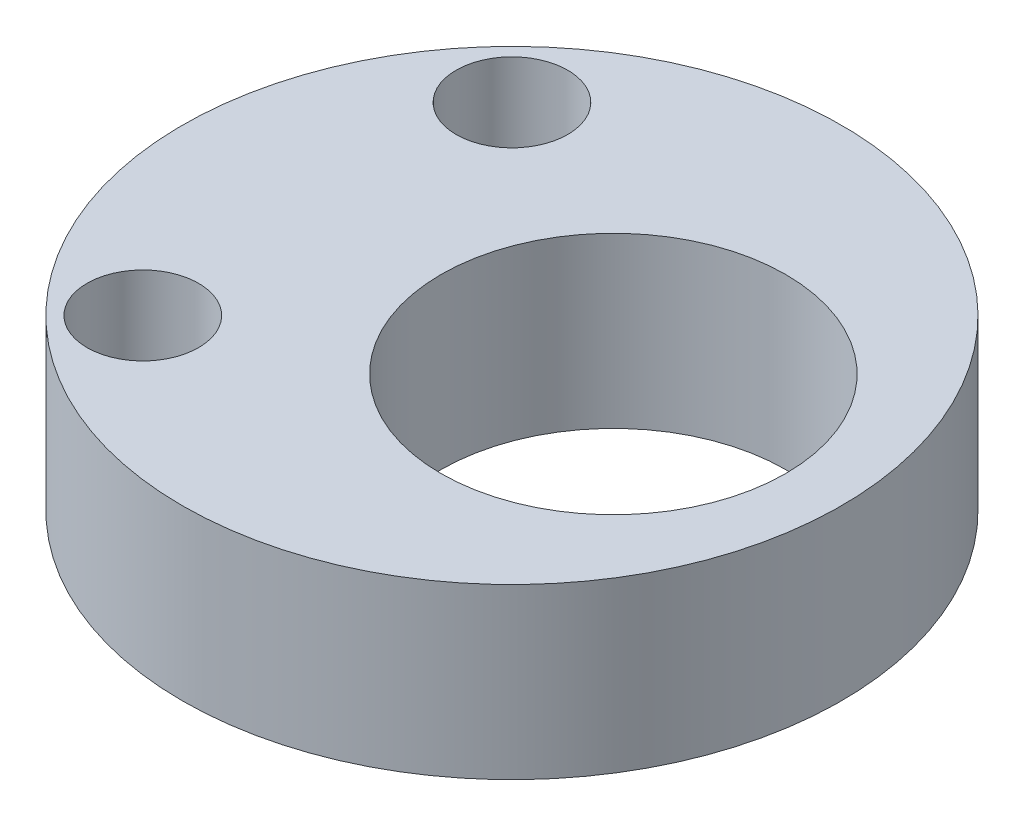
ISO-10303-21;
HEADER;
FILE_DESCRIPTION(('STEP AP214'),'2;1');
FILE_NAME('part.step','',(''),(''),'','','');
FILE_SCHEMA(('AUTOMOTIVE_DESIGN { 1 0 10303 214 1 1 1 1 }'));
ENDSEC;
DATA;
#1=APPLICATION_CONTEXT('core data for automotive mechanical design processes');
#2=APPLICATION_PROTOCOL_DEFINITION('international standard','automotive_design',2000,#1);
#3=PRODUCT_CONTEXT('',#1,'mechanical');
#4=PRODUCT('Part','Part','',(#3));
#5=PRODUCT_RELATED_PRODUCT_CATEGORY('part','',(#4));
#6=PRODUCT_DEFINITION_FORMATION('','',#4);
#7=PRODUCT_DEFINITION_CONTEXT('part definition',#1,'design');
#8=PRODUCT_DEFINITION('design','',#6,#7);
#9=PRODUCT_DEFINITION_SHAPE('','',#8);
#10=(LENGTH_UNIT() NAMED_UNIT(*) SI_UNIT(.MILLI.,.METRE.));
#11=(NAMED_UNIT(*) PLANE_ANGLE_UNIT() SI_UNIT($,.RADIAN.));
#12=(NAMED_UNIT(*) SI_UNIT($,.STERADIAN.) SOLID_ANGLE_UNIT());
#13=UNCERTAINTY_MEASURE_WITH_UNIT(LENGTH_MEASURE(1.E-05),#10,'distance_accuracy_value','');
#14=(GEOMETRIC_REPRESENTATION_CONTEXT(3) GLOBAL_UNCERTAINTY_ASSIGNED_CONTEXT((#13)) GLOBAL_UNIT_ASSIGNED_CONTEXT((#10,
#11,#12)) REPRESENTATION_CONTEXT('',''));
#15=CARTESIAN_POINT('',(0.,0.,0.));
#16=DIRECTION('',(0.,0.,1.));
#17=DIRECTION('',(1.,0.,0.));
#18=AXIS2_PLACEMENT_3D('',#15,#16,#17);
#19=CARTESIAN_POINT('',(3.,5.,0.));
#20=DIRECTION('',(0.,-1.,0.));
#21=DIRECTION('',(0.,0.,-1.));
#22=AXIS2_PLACEMENT_3D('',#19,#20,#21);
#23=CYLINDRICAL_SURFACE('',#22,5.1);
#24=CARTESIAN_POINT('',(3.,5.,0.));
#25=DIRECTION('',(0.,1.,0.));
#26=DIRECTION('',(0.,0.,1.));
#27=AXIS2_PLACEMENT_3D('',#24,#25,#26);
#28=CIRCLE('',#27,5.1);
#29=CARTESIAN_POINT('',(3.,5.,5.1));
#30=VERTEX_POINT('',#29);
#31=EDGE_CURVE('E41',#30,#30,#28,.T.);
#32=ORIENTED_EDGE('',*,*,#31,.T.);
#33=EDGE_LOOP('',(#32));
#34=FACE_BOUND('',#33,.T.);
#35=CARTESIAN_POINT('',(3.,0.,0.));
#36=DIRECTION('',(0.,1.,0.));
#37=DIRECTION('',(0.,0.,1.));
#38=AXIS2_PLACEMENT_3D('',#35,#36,#37);
#39=CIRCLE('',#38,5.1);
#40=CARTESIAN_POINT('',(3.,0.,5.1));
#41=VERTEX_POINT('',#40);
#42=EDGE_CURVE('E55',#41,#41,#39,.T.);
#43=ORIENTED_EDGE('',*,*,#42,.F.);
#44=EDGE_LOOP('',(#43));
#45=FACE_BOUND('',#44,.T.);
#46=ADVANCED_FACE('F33',(#34,#45),#23,.F.);
#47=CARTESIAN_POINT('',(-5.46,5.,-5.46));
#48=DIRECTION('',(0.,-1.,0.));
#49=DIRECTION('',(0.,0.,-1.));
#50=AXIS2_PLACEMENT_3D('',#47,#48,#49);
#51=CYLINDRICAL_SURFACE('',#50,1.65);
#52=CARTESIAN_POINT('',(-5.46,5.,-5.46));
#53=DIRECTION('',(0.,1.,0.));
#54=DIRECTION('',(0.,0.,1.));
#55=AXIS2_PLACEMENT_3D('',#52,#53,#54);
#56=CIRCLE('',#55,1.65);
#57=CARTESIAN_POINT('',(-5.46,5.,-3.81));
#58=VERTEX_POINT('',#57);
#59=EDGE_CURVE('E46',#58,#58,#56,.T.);
#60=ORIENTED_EDGE('',*,*,#59,.T.);
#61=EDGE_LOOP('',(#60));
#62=FACE_BOUND('',#61,.T.);
#63=CARTESIAN_POINT('',(-5.46,0.,-5.46));
#64=DIRECTION('',(0.,1.,0.));
#65=DIRECTION('',(0.,0.,1.));
#66=AXIS2_PLACEMENT_3D('',#63,#64,#65);
#67=CIRCLE('',#66,1.65);
#68=CARTESIAN_POINT('',(-5.46,0.,-3.81));
#69=VERTEX_POINT('',#68);
#70=EDGE_CURVE('E53',#69,#69,#67,.T.);
#71=ORIENTED_EDGE('',*,*,#70,.F.);
#72=EDGE_LOOP('',(#71));
#73=FACE_BOUND('',#72,.T.);
#74=ADVANCED_FACE('F70',(#62,#73),#51,.F.);
#75=CARTESIAN_POINT('',(-5.46,5.,5.46));
#76=DIRECTION('',(0.,-1.,0.));
#77=DIRECTION('',(0.,0.,-1.));
#78=AXIS2_PLACEMENT_3D('',#75,#76,#77);
#79=CYLINDRICAL_SURFACE('',#78,1.65);
#80=CARTESIAN_POINT('',(-5.46,5.,5.46));
#81=DIRECTION('',(0.,1.,0.));
#82=DIRECTION('',(0.,0.,1.));
#83=AXIS2_PLACEMENT_3D('',#80,#81,#82);
#84=CIRCLE('',#83,1.65);
#85=CARTESIAN_POINT('',(-5.46,5.,7.11));
#86=VERTEX_POINT('',#85);
#87=EDGE_CURVE('E60',#86,#86,#84,.T.);
#88=ORIENTED_EDGE('',*,*,#87,.T.);
#89=EDGE_LOOP('',(#88));
#90=FACE_BOUND('',#89,.T.);
#91=CARTESIAN_POINT('',(-5.46,0.,5.46));
#92=DIRECTION('',(0.,1.,0.));
#93=DIRECTION('',(0.,0.,1.));
#94=AXIS2_PLACEMENT_3D('',#91,#92,#93);
#95=CIRCLE('',#94,1.65);
#96=CARTESIAN_POINT('',(-5.46,0.,7.11));
#97=VERTEX_POINT('',#96);
#98=EDGE_CURVE('E50',#97,#97,#95,.T.);
#99=ORIENTED_EDGE('',*,*,#98,.F.);
#100=EDGE_LOOP('',(#99));
#101=FACE_BOUND('',#100,.T.);
#102=ADVANCED_FACE('F35',(#90,#101),#79,.F.);
#103=CARTESIAN_POINT('',(0.,5.,0.));
#104=DIRECTION('',(0.,-1.,0.));
#105=DIRECTION('',(0.,0.,-1.));
#106=AXIS2_PLACEMENT_3D('',#103,#104,#105);
#107=CYLINDRICAL_SURFACE('',#106,9.75);
#108=CARTESIAN_POINT('',(0.,5.,0.));
#109=DIRECTION('',(0.,1.,0.));
#110=DIRECTION('',(0.,0.,1.));
#111=AXIS2_PLACEMENT_3D('',#108,#109,#110);
#112=CIRCLE('',#111,9.75);
#113=CARTESIAN_POINT('',(0.,5.,9.75));
#114=VERTEX_POINT('',#113);
#115=EDGE_CURVE('E10',#114,#114,#112,.T.);
#116=ORIENTED_EDGE('',*,*,#115,.F.);
#117=EDGE_LOOP('',(#116));
#118=FACE_BOUND('',#117,.T.);
#119=CARTESIAN_POINT('',(0.,0.,0.));
#120=DIRECTION('',(0.,1.,0.));
#121=DIRECTION('',(0.,0.,1.));
#122=AXIS2_PLACEMENT_3D('',#119,#120,#121);
#123=CIRCLE('',#122,9.75);
#124=CARTESIAN_POINT('',(0.,0.,9.75));
#125=VERTEX_POINT('',#124);
#126=EDGE_CURVE('E37',#125,#125,#123,.T.);
#127=ORIENTED_EDGE('',*,*,#126,.T.);
#128=EDGE_LOOP('',(#127));
#129=FACE_BOUND('',#128,.T.);
#130=ADVANCED_FACE('F77',(#118,#129),#107,.T.);
#131=CARTESIAN_POINT('',(0.,5.,0.));
#132=DIRECTION('',(0.,1.,0.));
#133=DIRECTION('',(0.,0.,1.));
#134=AXIS2_PLACEMENT_3D('',#131,#132,#133);
#135=PLANE('',#134);
#136=ORIENTED_EDGE('',*,*,#87,.F.);
#137=EDGE_LOOP('',(#136));
#138=FACE_BOUND('',#137,.T.);
#139=ORIENTED_EDGE('',*,*,#59,.F.);
#140=EDGE_LOOP('',(#139));
#141=FACE_BOUND('',#140,.T.);
#142=ORIENTED_EDGE('',*,*,#31,.F.);
#143=EDGE_LOOP('',(#142));
#144=FACE_BOUND('',#143,.T.);
#145=ORIENTED_EDGE('',*,*,#115,.T.);
#146=EDGE_LOOP('',(#145));
#147=FACE_BOUND('',#146,.T.);
#148=ADVANCED_FACE('F73',(#138,#141,#144,#147),#135,.T.);
#149=CARTESIAN_POINT('',(0.,0.,0.));
#150=DIRECTION('',(0.,1.,0.));
#151=DIRECTION('',(0.,0.,1.));
#152=AXIS2_PLACEMENT_3D('',#149,#150,#151);
#153=PLANE('',#152);
#154=ORIENTED_EDGE('',*,*,#98,.T.);
#155=EDGE_LOOP('',(#154));
#156=FACE_BOUND('',#155,.T.);
#157=ORIENTED_EDGE('',*,*,#70,.T.);
#158=EDGE_LOOP('',(#157));
#159=FACE_BOUND('',#158,.T.);
#160=ORIENTED_EDGE('',*,*,#42,.T.);
#161=EDGE_LOOP('',(#160));
#162=FACE_BOUND('',#161,.T.);
#163=ORIENTED_EDGE('',*,*,#126,.F.);
#164=EDGE_LOOP('',(#163));
#165=FACE_BOUND('',#164,.T.);
#166=ADVANCED_FACE('F76',(#156,#159,#162,#165),#153,.F.);
#167=CLOSED_SHELL('',(#46,#74,#102,#130,#148,#166));
#168=MANIFOLD_SOLID_BREP('B2',#167);
#169=ADVANCED_BREP_SHAPE_REPRESENTATION('',(#18,#168),#14);
#170=SHAPE_DEFINITION_REPRESENTATION(#9,#169);
ENDSEC;
END-ISO-10303-21;
